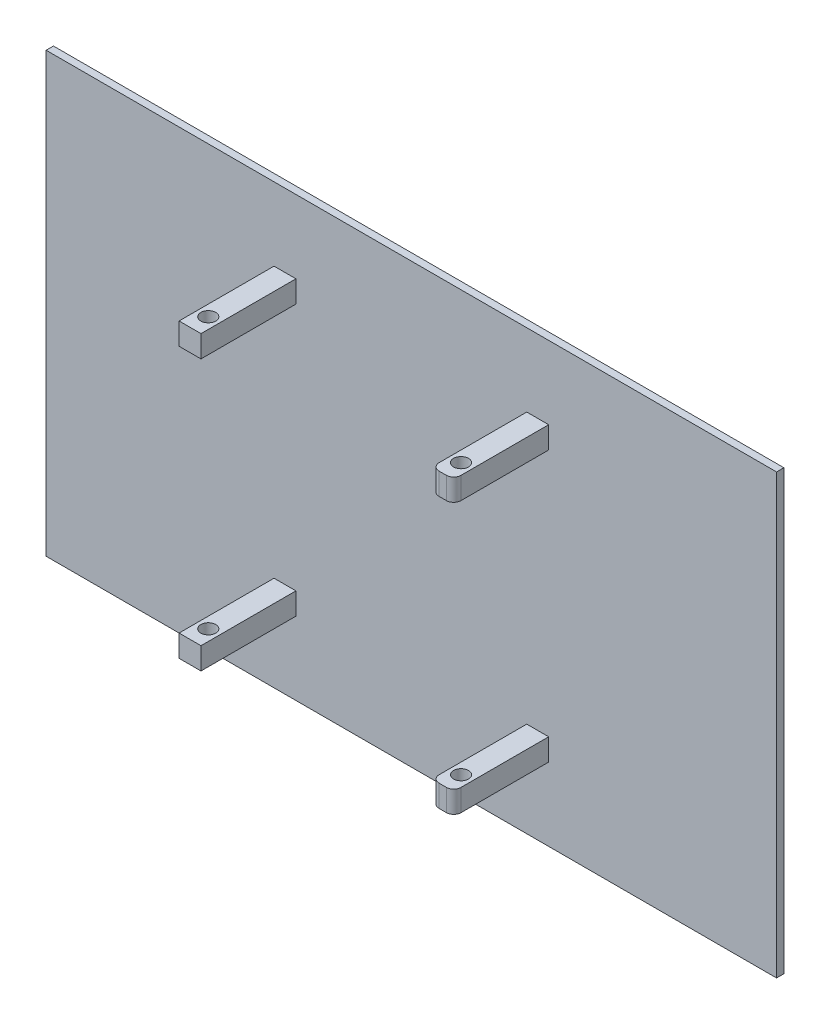
ISO-10303-21;
HEADER;
FILE_DESCRIPTION(('STEP AP214'),'2;1');
FILE_NAME('part.step','',(''),(''),'','','');
FILE_SCHEMA(('AUTOMOTIVE_DESIGN { 1 0 10303 214 1 1 1 1 }'));
ENDSEC;
DATA;
#1=APPLICATION_CONTEXT('core data for automotive mechanical design processes');
#2=APPLICATION_PROTOCOL_DEFINITION('international standard','automotive_design',2000,#1);
#3=PRODUCT_CONTEXT('',#1,'mechanical');
#4=PRODUCT('Part','Part','',(#3));
#5=PRODUCT_RELATED_PRODUCT_CATEGORY('part','',(#4));
#6=PRODUCT_DEFINITION_FORMATION('','',#4);
#7=PRODUCT_DEFINITION_CONTEXT('part definition',#1,'design');
#8=PRODUCT_DEFINITION('design','',#6,#7);
#9=PRODUCT_DEFINITION_SHAPE('','',#8);
#10=(LENGTH_UNIT() NAMED_UNIT(*) SI_UNIT(.MILLI.,.METRE.));
#11=(NAMED_UNIT(*) PLANE_ANGLE_UNIT() SI_UNIT($,.RADIAN.));
#12=(NAMED_UNIT(*) SI_UNIT($,.STERADIAN.) SOLID_ANGLE_UNIT());
#13=UNCERTAINTY_MEASURE_WITH_UNIT(LENGTH_MEASURE(1.E-05),#10,'distance_accuracy_value','');
#14=(GEOMETRIC_REPRESENTATION_CONTEXT(3) GLOBAL_UNCERTAINTY_ASSIGNED_CONTEXT((#13)) GLOBAL_UNIT_ASSIGNED_CONTEXT((#10,
#11,#12)) REPRESENTATION_CONTEXT('',''));
#15=CARTESIAN_POINT('',(0.,0.,0.));
#16=DIRECTION('',(0.,0.,1.));
#17=DIRECTION('',(1.,0.,0.));
#18=AXIS2_PLACEMENT_3D('',#15,#16,#17);
#19=CARTESIAN_POINT('',(0.,0.,1.));
#20=DIRECTION('',(0.,0.,-1.));
#21=DIRECTION('',(-1.,0.,0.));
#22=AXIS2_PLACEMENT_3D('',#19,#20,#21);
#23=PLANE('',#22);
#24=DIRECTION('',(0.,-1.,0.));
#25=VECTOR('',#24,1.);
#26=CARTESIAN_POINT('',(15.8,0.,1.));
#27=LINE('',#26,#25);
#28=CARTESIAN_POINT('',(15.8,-17.,0.999999999999999));
#29=VERTEX_POINT('',#28);
#30=CARTESIAN_POINT('',(15.8,-20.,1.));
#31=VERTEX_POINT('',#30);
#32=EDGE_CURVE('E259',#29,#31,#27,.T.);
#33=ORIENTED_EDGE('',*,*,#32,.F.);
#34=DIRECTION('',(-1.,0.,0.));
#35=VECTOR('',#34,1.);
#36=CARTESIAN_POINT('',(0.,-17.,1.));
#37=LINE('',#36,#35);
#38=CARTESIAN_POINT('',(18.8,-17.,1.));
#39=VERTEX_POINT('',#38);
#40=EDGE_CURVE('E250',#39,#29,#37,.T.);
#41=ORIENTED_EDGE('',*,*,#40,.F.);
#42=DIRECTION('',(0.,1.,0.));
#43=VECTOR('',#42,1.);
#44=CARTESIAN_POINT('',(18.8,0.,1.));
#45=LINE('',#44,#43);
#46=CARTESIAN_POINT('',(18.8,-20.,1.));
#47=VERTEX_POINT('',#46);
#48=EDGE_CURVE('E253',#47,#39,#45,.T.);
#49=ORIENTED_EDGE('',*,*,#48,.F.);
#50=DIRECTION('',(1.,0.,0.));
#51=VECTOR('',#50,1.);
#52=CARTESIAN_POINT('',(0.,-20.,1.));
#53=LINE('',#52,#51);
#54=EDGE_CURVE('E256',#31,#47,#53,.T.);
#55=ORIENTED_EDGE('',*,*,#54,.F.);
#56=EDGE_LOOP('',(#33,#41,#49,#55));
#57=FACE_BOUND('',#56,.T.);
#58=DIRECTION('',(0.,1.,0.));
#59=VECTOR('',#58,1.);
#60=CARTESIAN_POINT('',(18.8,0.,1.));
#61=LINE('',#60,#59);
#62=CARTESIAN_POINT('',(18.8,17.,0.999999999999999));
#63=VERTEX_POINT('',#62);
#64=CARTESIAN_POINT('',(18.8,20.,1.));
#65=VERTEX_POINT('',#64);
#66=EDGE_CURVE('E318',#63,#65,#61,.T.);
#67=ORIENTED_EDGE('',*,*,#66,.F.);
#68=DIRECTION('',(1.,0.,0.));
#69=VECTOR('',#68,1.);
#70=CARTESIAN_POINT('',(0.,17.,1.));
#71=LINE('',#70,#69);
#72=CARTESIAN_POINT('',(15.8,17.,1.));
#73=VERTEX_POINT('',#72);
#74=EDGE_CURVE('E309',#73,#63,#71,.T.);
#75=ORIENTED_EDGE('',*,*,#74,.F.);
#76=DIRECTION('',(0.,-1.,0.));
#77=VECTOR('',#76,1.);
#78=CARTESIAN_POINT('',(15.8,0.,1.));
#79=LINE('',#78,#77);
#80=CARTESIAN_POINT('',(15.8,20.,1.));
#81=VERTEX_POINT('',#80);
#82=EDGE_CURVE('E312',#81,#73,#79,.T.);
#83=ORIENTED_EDGE('',*,*,#82,.F.);
#84=DIRECTION('',(-1.,0.,0.));
#85=VECTOR('',#84,1.);
#86=CARTESIAN_POINT('',(0.,20.,1.));
#87=LINE('',#86,#85);
#88=EDGE_CURVE('E315',#65,#81,#87,.T.);
#89=ORIENTED_EDGE('',*,*,#88,.F.);
#90=EDGE_LOOP('',(#67,#75,#83,#89));
#91=FACE_BOUND('',#90,.T.);
#92=DIRECTION('',(0.,1.,0.));
#93=VECTOR('',#92,1.);
#94=CARTESIAN_POINT('',(50.,-30.,1.));
#95=LINE('',#94,#93);
#96=CARTESIAN_POINT('',(50.,-30.,1.));
#97=VERTEX_POINT('',#96);
#98=CARTESIAN_POINT('',(50.,30.,1.));
#99=VERTEX_POINT('',#98);
#100=EDGE_CURVE('E322',#97,#99,#95,.T.);
#101=ORIENTED_EDGE('',*,*,#100,.T.);
#102=DIRECTION('',(-1.,0.,0.));
#103=VECTOR('',#102,1.);
#104=CARTESIAN_POINT('',(-50.,30.,1.));
#105=LINE('',#104,#103);
#106=CARTESIAN_POINT('',(-50.,30.,1.));
#107=VERTEX_POINT('',#106);
#108=EDGE_CURVE('E325',#99,#107,#105,.T.);
#109=ORIENTED_EDGE('',*,*,#108,.T.);
#110=DIRECTION('',(0.,-1.,0.));
#111=VECTOR('',#110,1.);
#112=CARTESIAN_POINT('',(-50.,-30.,1.));
#113=LINE('',#112,#111);
#114=CARTESIAN_POINT('',(-50.,-30.,1.));
#115=VERTEX_POINT('',#114);
#116=EDGE_CURVE('E328',#107,#115,#113,.T.);
#117=ORIENTED_EDGE('',*,*,#116,.T.);
#118=DIRECTION('',(1.,0.,0.));
#119=VECTOR('',#118,1.);
#120=CARTESIAN_POINT('',(-50.,-30.,1.));
#121=LINE('',#120,#119);
#122=EDGE_CURVE('E330',#115,#97,#121,.T.);
#123=ORIENTED_EDGE('',*,*,#122,.T.);
#124=EDGE_LOOP('',(#101,#109,#117,#123));
#125=FACE_BOUND('',#124,.T.);
#126=DIRECTION('',(-1.,0.,0.));
#127=VECTOR('',#126,1.);
#128=CARTESIAN_POINT('',(0.,-17.,1.));
#129=LINE('',#128,#127);
#130=CARTESIAN_POINT('',(-15.8,-17.,0.999999999999999));
#131=VERTEX_POINT('',#130);
#132=CARTESIAN_POINT('',(-18.8,-17.,1.));
#133=VERTEX_POINT('',#132);
#134=EDGE_CURVE('E292',#131,#133,#129,.T.);
#135=ORIENTED_EDGE('',*,*,#134,.F.);
#136=DIRECTION('',(0.,1.,0.));
#137=VECTOR('',#136,1.);
#138=CARTESIAN_POINT('',(-15.8,0.,1.));
#139=LINE('',#138,#137);
#140=CARTESIAN_POINT('',(-15.8,-20.,1.));
#141=VERTEX_POINT('',#140);
#142=EDGE_CURVE('E283',#141,#131,#139,.T.);
#143=ORIENTED_EDGE('',*,*,#142,.F.);
#144=DIRECTION('',(1.,0.,0.));
#145=VECTOR('',#144,1.);
#146=CARTESIAN_POINT('',(0.,-20.,1.));
#147=LINE('',#146,#145);
#148=CARTESIAN_POINT('',(-18.8,-20.,1.));
#149=VERTEX_POINT('',#148);
#150=EDGE_CURVE('E286',#149,#141,#147,.T.);
#151=ORIENTED_EDGE('',*,*,#150,.F.);
#152=DIRECTION('',(0.,-1.,0.));
#153=VECTOR('',#152,1.);
#154=CARTESIAN_POINT('',(-18.8,0.,1.));
#155=LINE('',#154,#153);
#156=EDGE_CURVE('E289',#133,#149,#155,.T.);
#157=ORIENTED_EDGE('',*,*,#156,.F.);
#158=EDGE_LOOP('',(#135,#143,#151,#157));
#159=FACE_BOUND('',#158,.T.);
#160=DIRECTION('',(1.,0.,0.));
#161=VECTOR('',#160,1.);
#162=CARTESIAN_POINT('',(0.,17.,1.));
#163=LINE('',#162,#161);
#164=CARTESIAN_POINT('',(-18.8,17.,0.999999999999999));
#165=VERTEX_POINT('',#164);
#166=CARTESIAN_POINT('',(-15.8,17.,1.));
#167=VERTEX_POINT('',#166);
#168=EDGE_CURVE('E222',#165,#167,#163,.T.);
#169=ORIENTED_EDGE('',*,*,#168,.F.);
#170=DIRECTION('',(0.,-1.,0.));
#171=VECTOR('',#170,1.);
#172=CARTESIAN_POINT('',(-18.8,0.,1.));
#173=LINE('',#172,#171);
#174=CARTESIAN_POINT('',(-18.8,20.,1.));
#175=VERTEX_POINT('',#174);
#176=EDGE_CURVE('E223',#175,#165,#173,.T.);
#177=ORIENTED_EDGE('',*,*,#176,.F.);
#178=DIRECTION('',(-1.,0.,0.));
#179=VECTOR('',#178,1.);
#180=CARTESIAN_POINT('',(0.,20.,1.));
#181=LINE('',#180,#179);
#182=CARTESIAN_POINT('',(-15.8,20.,1.));
#183=VERTEX_POINT('',#182);
#184=EDGE_CURVE('E226',#183,#175,#181,.T.);
#185=ORIENTED_EDGE('',*,*,#184,.F.);
#186=DIRECTION('',(0.,1.,0.));
#187=VECTOR('',#186,1.);
#188=CARTESIAN_POINT('',(-15.8,0.,1.));
#189=LINE('',#188,#187);
#190=EDGE_CURVE('E234',#167,#183,#189,.T.);
#191=ORIENTED_EDGE('',*,*,#190,.F.);
#192=EDGE_LOOP('',(#169,#177,#185,#191));
#193=FACE_BOUND('',#192,.T.);
#194=ADVANCED_FACE('F39',(#57,#91,#125,#159,#193),#23,.F.);
#195=CARTESIAN_POINT('',(50.,-30.,1.));
#196=DIRECTION('',(-1.,0.,0.));
#197=DIRECTION('',(0.,0.,1.));
#198=AXIS2_PLACEMENT_3D('',#195,#196,#197);
#199=PLANE('',#198);
#200=DIRECTION('',(0.,1.,0.));
#201=VECTOR('',#200,1.);
#202=CARTESIAN_POINT('',(50.,-30.,0.));
#203=LINE('',#202,#201);
#204=CARTESIAN_POINT('',(50.,-30.,0.));
#205=VERTEX_POINT('',#204);
#206=CARTESIAN_POINT('',(50.,30.,0.));
#207=VERTEX_POINT('',#206);
#208=EDGE_CURVE('E321',#205,#207,#203,.T.);
#209=ORIENTED_EDGE('',*,*,#208,.T.);
#210=DIRECTION('',(0.,0.,-1.));
#211=VECTOR('',#210,1.);
#212=CARTESIAN_POINT('',(50.,30.,1.));
#213=LINE('',#212,#211);
#214=EDGE_CURVE('E348',#99,#207,#213,.T.);
#215=ORIENTED_EDGE('',*,*,#214,.F.);
#216=ORIENTED_EDGE('',*,*,#100,.F.);
#217=DIRECTION('',(0.,0.,-1.));
#218=VECTOR('',#217,1.);
#219=CARTESIAN_POINT('',(50.,-30.,1.));
#220=LINE('',#219,#218);
#221=EDGE_CURVE('E332',#97,#205,#220,.T.);
#222=ORIENTED_EDGE('',*,*,#221,.T.);
#223=EDGE_LOOP('',(#209,#215,#216,#222));
#224=FACE_BOUND('',#223,.T.);
#225=ADVANCED_FACE('F415',(#224),#199,.F.);
#226=CARTESIAN_POINT('',(-50.,30.,1.));
#227=DIRECTION('',(0.,-1.,0.));
#228=DIRECTION('',(0.,0.,-1.));
#229=AXIS2_PLACEMENT_3D('',#226,#227,#228);
#230=PLANE('',#229);
#231=DIRECTION('',(-1.,0.,0.));
#232=VECTOR('',#231,1.);
#233=CARTESIAN_POINT('',(-50.,30.,0.));
#234=LINE('',#233,#232);
#235=CARTESIAN_POINT('',(-50.,30.,0.));
#236=VERTEX_POINT('',#235);
#237=EDGE_CURVE('E335',#207,#236,#234,.T.);
#238=ORIENTED_EDGE('',*,*,#237,.T.);
#239=DIRECTION('',(0.,0.,-1.));
#240=VECTOR('',#239,1.);
#241=CARTESIAN_POINT('',(-50.,30.,1.));
#242=LINE('',#241,#240);
#243=EDGE_CURVE('E345',#107,#236,#242,.T.);
#244=ORIENTED_EDGE('',*,*,#243,.F.);
#245=ORIENTED_EDGE('',*,*,#108,.F.);
#246=ORIENTED_EDGE('',*,*,#214,.T.);
#247=EDGE_LOOP('',(#238,#244,#245,#246));
#248=FACE_BOUND('',#247,.T.);
#249=ADVANCED_FACE('F423',(#248),#230,.F.);
#250=CARTESIAN_POINT('',(-50.,-30.,1.));
#251=DIRECTION('',(1.,0.,0.));
#252=DIRECTION('',(0.,0.,-1.));
#253=AXIS2_PLACEMENT_3D('',#250,#251,#252);
#254=PLANE('',#253);
#255=DIRECTION('',(0.,-1.,0.));
#256=VECTOR('',#255,1.);
#257=CARTESIAN_POINT('',(-50.,-30.,0.));
#258=LINE('',#257,#256);
#259=CARTESIAN_POINT('',(-50.,-30.,0.));
#260=VERTEX_POINT('',#259);
#261=EDGE_CURVE('E337',#236,#260,#258,.T.);
#262=ORIENTED_EDGE('',*,*,#261,.T.);
#263=DIRECTION('',(0.,0.,-1.));
#264=VECTOR('',#263,1.);
#265=CARTESIAN_POINT('',(-50.,-30.,1.));
#266=LINE('',#265,#264);
#267=EDGE_CURVE('E342',#115,#260,#266,.T.);
#268=ORIENTED_EDGE('',*,*,#267,.F.);
#269=ORIENTED_EDGE('',*,*,#116,.F.);
#270=ORIENTED_EDGE('',*,*,#243,.T.);
#271=EDGE_LOOP('',(#262,#268,#269,#270));
#272=FACE_BOUND('',#271,.T.);
#273=ADVANCED_FACE('F438',(#272),#254,.F.);
#274=CARTESIAN_POINT('',(-50.,-30.,1.));
#275=DIRECTION('',(0.,1.,0.));
#276=DIRECTION('',(0.,0.,1.));
#277=AXIS2_PLACEMENT_3D('',#274,#275,#276);
#278=PLANE('',#277);
#279=DIRECTION('',(1.,0.,0.));
#280=VECTOR('',#279,1.);
#281=CARTESIAN_POINT('',(-50.,-30.,0.));
#282=LINE('',#281,#280);
#283=EDGE_CURVE('E326',#260,#205,#282,.T.);
#284=ORIENTED_EDGE('',*,*,#283,.T.);
#285=ORIENTED_EDGE('',*,*,#221,.F.);
#286=ORIENTED_EDGE('',*,*,#122,.F.);
#287=ORIENTED_EDGE('',*,*,#267,.T.);
#288=EDGE_LOOP('',(#284,#285,#286,#287));
#289=FACE_BOUND('',#288,.T.);
#290=ADVANCED_FACE('F434',(#289),#278,.F.);
#291=CARTESIAN_POINT('',(0.,0.,0.));
#292=DIRECTION('',(0.,0.,-1.));
#293=DIRECTION('',(-1.,0.,0.));
#294=AXIS2_PLACEMENT_3D('',#291,#292,#293);
#295=PLANE('',#294);
#296=ORIENTED_EDGE('',*,*,#208,.F.);
#297=ORIENTED_EDGE('',*,*,#283,.F.);
#298=ORIENTED_EDGE('',*,*,#261,.F.);
#299=ORIENTED_EDGE('',*,*,#237,.F.);
#300=EDGE_LOOP('',(#296,#297,#298,#299));
#301=FACE_BOUND('',#300,.T.);
#302=ADVANCED_FACE('F432',(#301),#295,.T.);
#303=CARTESIAN_POINT('',(18.8,17.,14.));
#304=DIRECTION('',(-1.,0.,0.));
#305=DIRECTION('',(0.,0.,1.));
#306=AXIS2_PLACEMENT_3D('',#303,#304,#305);
#307=PLANE('',#306);
#308=DIRECTION('',(0.,0.,-1.));
#309=VECTOR('',#308,1.);
#310=CARTESIAN_POINT('',(18.8,20.,14.));
#311=LINE('',#310,#309);
#312=CARTESIAN_POINT('',(18.8,20.,13.));
#313=VERTEX_POINT('',#312);
#314=EDGE_CURVE('E307',#313,#65,#311,.T.);
#315=ORIENTED_EDGE('',*,*,#314,.F.);
#316=DIRECTION('',(0.,1.,0.));
#317=VECTOR('',#316,1.);
#318=CARTESIAN_POINT('',(18.8,17.,13.));
#319=LINE('',#318,#317);
#320=CARTESIAN_POINT('',(18.8,17.,13.));
#321=VERTEX_POINT('',#320);
#322=EDGE_CURVE('E386',#313,#321,#319,.F.);
#323=ORIENTED_EDGE('',*,*,#322,.T.);
#324=DIRECTION('',(0.,0.,-1.));
#325=VECTOR('',#324,1.);
#326=CARTESIAN_POINT('',(18.8,17.,14.));
#327=LINE('',#326,#325);
#328=EDGE_CURVE('E301',#321,#63,#327,.T.);
#329=ORIENTED_EDGE('',*,*,#328,.T.);
#330=ORIENTED_EDGE('',*,*,#66,.T.);
#331=EDGE_LOOP('',(#315,#323,#329,#330));
#332=FACE_BOUND('',#331,.T.);
#333=ADVANCED_FACE('F430',(#332),#307,.F.);
#334=CARTESIAN_POINT('',(15.8,20.,14.));
#335=DIRECTION('',(0.,-1.,0.));
#336=DIRECTION('',(0.,0.,-1.));
#337=AXIS2_PLACEMENT_3D('',#334,#335,#336);
#338=PLANE('',#337);
#339=CARTESIAN_POINT('',(17.3,20.,11.5));
#340=DIRECTION('',(0.,-1.,0.));
#341=DIRECTION('',(0.,0.,-1.));
#342=AXIS2_PLACEMENT_3D('',#339,#340,#341);
#343=CIRCLE('',#342,1.025);
#344=CARTESIAN_POINT('',(17.3,20.,10.475));
#345=VERTEX_POINT('',#344);
#346=EDGE_CURVE('E218',#345,#345,#343,.T.);
#347=ORIENTED_EDGE('',*,*,#346,.T.);
#348=EDGE_LOOP('',(#347));
#349=FACE_BOUND('',#348,.T.);
#350=DIRECTION('',(0.,0.,-1.));
#351=VECTOR('',#350,1.);
#352=CARTESIAN_POINT('',(15.8,20.,14.));
#353=LINE('',#352,#351);
#354=CARTESIAN_POINT('',(15.8,20.,13.));
#355=VERTEX_POINT('',#354);
#356=EDGE_CURVE('E305',#355,#81,#353,.T.);
#357=ORIENTED_EDGE('',*,*,#356,.F.);
#358=CARTESIAN_POINT('',(16.8,20.,13.));
#359=DIRECTION('',(0.,-1.,0.));
#360=DIRECTION('',(0.,0.,-1.));
#361=AXIS2_PLACEMENT_3D('',#358,#359,#360);
#362=CIRCLE('',#361,1.);
#363=CARTESIAN_POINT('',(16.8,20.,14.));
#364=VERTEX_POINT('',#363);
#365=EDGE_CURVE('E384',#355,#364,#362,.F.);
#366=ORIENTED_EDGE('',*,*,#365,.T.);
#367=DIRECTION('',(-1.,0.,0.));
#368=VECTOR('',#367,1.);
#369=CARTESIAN_POINT('',(15.8,20.,14.));
#370=LINE('',#369,#368);
#371=CARTESIAN_POINT('',(17.8,20.,14.));
#372=VERTEX_POINT('',#371);
#373=EDGE_CURVE('E295',#372,#364,#370,.T.);
#374=ORIENTED_EDGE('',*,*,#373,.F.);
#375=CARTESIAN_POINT('',(17.8,20.,13.));
#376=DIRECTION('',(0.,-1.,0.));
#377=DIRECTION('',(0.,0.,-1.));
#378=AXIS2_PLACEMENT_3D('',#375,#376,#377);
#379=CIRCLE('',#378,1.);
#380=EDGE_CURVE('E382',#372,#313,#379,.F.);
#381=ORIENTED_EDGE('',*,*,#380,.T.);
#382=ORIENTED_EDGE('',*,*,#314,.T.);
#383=ORIENTED_EDGE('',*,*,#88,.T.);
#384=EDGE_LOOP('',(#357,#366,#374,#381,#382,#383));
#385=FACE_BOUND('',#384,.T.);
#386=ADVANCED_FACE('F459',(#349,#385),#338,.F.);
#387=CARTESIAN_POINT('',(15.8,17.,14.));
#388=DIRECTION('',(1.,0.,0.));
#389=DIRECTION('',(0.,0.,-1.));
#390=AXIS2_PLACEMENT_3D('',#387,#388,#389);
#391=PLANE('',#390);
#392=DIRECTION('',(0.,0.,-1.));
#393=VECTOR('',#392,1.);
#394=CARTESIAN_POINT('',(15.8,17.,14.));
#395=LINE('',#394,#393);
#396=CARTESIAN_POINT('',(15.8,17.,13.));
#397=VERTEX_POINT('',#396);
#398=EDGE_CURVE('E303',#397,#73,#395,.T.);
#399=ORIENTED_EDGE('',*,*,#398,.F.);
#400=DIRECTION('',(0.,-1.,0.));
#401=VECTOR('',#400,1.);
#402=CARTESIAN_POINT('',(15.8,17.,13.));
#403=LINE('',#402,#401);
#404=EDGE_CURVE('E380',#397,#355,#403,.F.);
#405=ORIENTED_EDGE('',*,*,#404,.T.);
#406=ORIENTED_EDGE('',*,*,#356,.T.);
#407=ORIENTED_EDGE('',*,*,#82,.T.);
#408=EDGE_LOOP('',(#399,#405,#406,#407));
#409=FACE_BOUND('',#408,.T.);
#410=ADVANCED_FACE('F478',(#409),#391,.F.);
#411=CARTESIAN_POINT('',(15.8,17.,14.));
#412=DIRECTION('',(0.,1.,0.));
#413=DIRECTION('',(0.,0.,1.));
#414=AXIS2_PLACEMENT_3D('',#411,#412,#413);
#415=PLANE('',#414);
#416=CARTESIAN_POINT('',(17.3,17.,11.5));
#417=DIRECTION('',(0.,1.,0.));
#418=DIRECTION('',(0.,0.,1.));
#419=AXIS2_PLACEMENT_3D('',#416,#417,#418);
#420=CIRCLE('',#419,1.025);
#421=CARTESIAN_POINT('',(17.3,17.,12.525));
#422=VERTEX_POINT('',#421);
#423=EDGE_CURVE('E563',#422,#422,#420,.T.);
#424=ORIENTED_EDGE('',*,*,#423,.T.);
#425=EDGE_LOOP('',(#424));
#426=FACE_BOUND('',#425,.T.);
#427=DIRECTION('',(1.,0.,0.));
#428=VECTOR('',#427,1.);
#429=CARTESIAN_POINT('',(15.8,17.,14.));
#430=LINE('',#429,#428);
#431=CARTESIAN_POINT('',(16.8,17.,14.));
#432=VERTEX_POINT('',#431);
#433=CARTESIAN_POINT('',(17.8,17.,14.));
#434=VERTEX_POINT('',#433);
#435=EDGE_CURVE('E298',#432,#434,#430,.T.);
#436=ORIENTED_EDGE('',*,*,#435,.F.);
#437=CARTESIAN_POINT('',(16.8,17.,13.));
#438=DIRECTION('',(0.,1.,0.));
#439=DIRECTION('',(0.,0.,1.));
#440=AXIS2_PLACEMENT_3D('',#437,#438,#439);
#441=CIRCLE('',#440,1.);
#442=EDGE_CURVE('E378',#432,#397,#441,.F.);
#443=ORIENTED_EDGE('',*,*,#442,.T.);
#444=ORIENTED_EDGE('',*,*,#398,.T.);
#445=ORIENTED_EDGE('',*,*,#74,.T.);
#446=ORIENTED_EDGE('',*,*,#328,.F.);
#447=CARTESIAN_POINT('',(17.8,17.,13.));
#448=DIRECTION('',(0.,1.,0.));
#449=DIRECTION('',(0.,0.,1.));
#450=AXIS2_PLACEMENT_3D('',#447,#448,#449);
#451=CIRCLE('',#450,1.);
#452=EDGE_CURVE('E376',#321,#434,#451,.F.);
#453=ORIENTED_EDGE('',*,*,#452,.T.);
#454=EDGE_LOOP('',(#436,#443,#444,#445,#446,#453));
#455=FACE_BOUND('',#454,.T.);
#456=ADVANCED_FACE('F475',(#426,#455),#415,.F.);
#457=CARTESIAN_POINT('',(0.,0.,14.));
#458=DIRECTION('',(0.,0.,-1.));
#459=DIRECTION('',(-1.,0.,0.));
#460=AXIS2_PLACEMENT_3D('',#457,#458,#459);
#461=PLANE('',#460);
#462=ORIENTED_EDGE('',*,*,#373,.T.);
#463=DIRECTION('',(0.,-1.,0.));
#464=VECTOR('',#463,1.);
#465=CARTESIAN_POINT('',(16.8,0.,14.));
#466=LINE('',#465,#464);
#467=EDGE_CURVE('E373',#364,#432,#466,.T.);
#468=ORIENTED_EDGE('',*,*,#467,.T.);
#469=ORIENTED_EDGE('',*,*,#435,.T.);
#470=DIRECTION('',(0.,1.,0.));
#471=VECTOR('',#470,1.);
#472=CARTESIAN_POINT('',(17.8,0.,14.));
#473=LINE('',#472,#471);
#474=EDGE_CURVE('E370',#434,#372,#473,.T.);
#475=ORIENTED_EDGE('',*,*,#474,.T.);
#476=EDGE_LOOP('',(#462,#468,#469,#475));
#477=FACE_BOUND('',#476,.T.);
#478=ADVANCED_FACE('F461',(#477),#461,.F.);
#479=CARTESIAN_POINT('',(-15.8,-17.,14.));
#480=DIRECTION('',(0.,-1.,0.));
#481=DIRECTION('',(0.,0.,-1.));
#482=AXIS2_PLACEMENT_3D('',#479,#480,#481);
#483=PLANE('',#482);
#484=CARTESIAN_POINT('',(-17.3,-17.,11.5));
#485=DIRECTION('',(0.,-1.,0.));
#486=DIRECTION('',(0.,0.,-1.));
#487=AXIS2_PLACEMENT_3D('',#484,#485,#486);
#488=CIRCLE('',#487,1.025);
#489=CARTESIAN_POINT('',(-17.3,-17.,10.475));
#490=VERTEX_POINT('',#489);
#491=EDGE_CURVE('E360',#490,#490,#488,.F.);
#492=ORIENTED_EDGE('',*,*,#491,.F.);
#493=EDGE_LOOP('',(#492));
#494=FACE_BOUND('',#493,.T.);
#495=DIRECTION('',(0.,0.,-1.));
#496=VECTOR('',#495,1.);
#497=CARTESIAN_POINT('',(-15.8,-17.,14.));
#498=LINE('',#497,#496);
#499=CARTESIAN_POINT('',(-15.8,-17.,14.));
#500=VERTEX_POINT('',#499);
#501=EDGE_CURVE('E271',#500,#131,#498,.T.);
#502=ORIENTED_EDGE('',*,*,#501,.T.);
#503=ORIENTED_EDGE('',*,*,#134,.T.);
#504=DIRECTION('',(0.,0.,-1.));
#505=VECTOR('',#504,1.);
#506=CARTESIAN_POINT('',(-18.8,-17.,14.));
#507=LINE('',#506,#505);
#508=CARTESIAN_POINT('',(-18.8,-17.,14.));
#509=VERTEX_POINT('',#508);
#510=EDGE_CURVE('E280',#509,#133,#507,.T.);
#511=ORIENTED_EDGE('',*,*,#510,.F.);
#512=DIRECTION('',(-1.,0.,0.));
#513=VECTOR('',#512,1.);
#514=CARTESIAN_POINT('',(-15.8,-17.,14.));
#515=LINE('',#514,#513);
#516=EDGE_CURVE('E262',#500,#509,#515,.T.);
#517=ORIENTED_EDGE('',*,*,#516,.F.);
#518=EDGE_LOOP('',(#502,#503,#511,#517));
#519=FACE_BOUND('',#518,.T.);
#520=ADVANCED_FACE('F491',(#494,#519),#483,.F.);
#521=CARTESIAN_POINT('',(-18.8,-17.,14.));
#522=DIRECTION('',(1.,0.,0.));
#523=DIRECTION('',(0.,0.,-1.));
#524=AXIS2_PLACEMENT_3D('',#521,#522,#523);
#525=PLANE('',#524);
#526=ORIENTED_EDGE('',*,*,#510,.T.);
#527=ORIENTED_EDGE('',*,*,#156,.T.);
#528=DIRECTION('',(0.,0.,-1.));
#529=VECTOR('',#528,1.);
#530=CARTESIAN_POINT('',(-18.8,-20.,14.));
#531=LINE('',#530,#529);
#532=CARTESIAN_POINT('',(-18.8,-20.,14.));
#533=VERTEX_POINT('',#532);
#534=EDGE_CURVE('E277',#533,#149,#531,.T.);
#535=ORIENTED_EDGE('',*,*,#534,.F.);
#536=DIRECTION('',(0.,-1.,0.));
#537=VECTOR('',#536,1.);
#538=CARTESIAN_POINT('',(-18.8,-17.,14.));
#539=LINE('',#538,#537);
#540=EDGE_CURVE('E265',#509,#533,#539,.T.);
#541=ORIENTED_EDGE('',*,*,#540,.F.);
#542=EDGE_LOOP('',(#526,#527,#535,#541));
#543=FACE_BOUND('',#542,.T.);
#544=ADVANCED_FACE('F494',(#543),#525,.F.);
#545=CARTESIAN_POINT('',(-15.8,-20.,14.));
#546=DIRECTION('',(0.,1.,0.));
#547=DIRECTION('',(0.,0.,1.));
#548=AXIS2_PLACEMENT_3D('',#545,#546,#547);
#549=PLANE('',#548);
#550=CARTESIAN_POINT('',(-17.3,-20.,11.5));
#551=DIRECTION('',(0.,1.,0.));
#552=DIRECTION('',(0.,0.,1.));
#553=AXIS2_PLACEMENT_3D('',#550,#551,#552);
#554=CIRCLE('',#553,1.025);
#555=CARTESIAN_POINT('',(-17.3,-20.,12.525));
#556=VERTEX_POINT('',#555);
#557=EDGE_CURVE('E581',#556,#556,#554,.F.);
#558=ORIENTED_EDGE('',*,*,#557,.F.);
#559=EDGE_LOOP('',(#558));
#560=FACE_BOUND('',#559,.T.);
#561=ORIENTED_EDGE('',*,*,#534,.T.);
#562=ORIENTED_EDGE('',*,*,#150,.T.);
#563=DIRECTION('',(0.,0.,-1.));
#564=VECTOR('',#563,1.);
#565=CARTESIAN_POINT('',(-15.8,-20.,14.));
#566=LINE('',#565,#564);
#567=CARTESIAN_POINT('',(-15.8,-20.,14.));
#568=VERTEX_POINT('',#567);
#569=EDGE_CURVE('E274',#568,#141,#566,.T.);
#570=ORIENTED_EDGE('',*,*,#569,.F.);
#571=DIRECTION('',(1.,0.,0.));
#572=VECTOR('',#571,1.);
#573=CARTESIAN_POINT('',(-15.8,-20.,14.));
#574=LINE('',#573,#572);
#575=EDGE_CURVE('E267',#533,#568,#574,.T.);
#576=ORIENTED_EDGE('',*,*,#575,.F.);
#577=EDGE_LOOP('',(#561,#562,#570,#576));
#578=FACE_BOUND('',#577,.T.);
#579=ADVANCED_FACE('F498',(#560,#578),#549,.F.);
#580=CARTESIAN_POINT('',(-15.8,-17.,14.));
#581=DIRECTION('',(-1.,0.,0.));
#582=DIRECTION('',(0.,0.,1.));
#583=AXIS2_PLACEMENT_3D('',#580,#581,#582);
#584=PLANE('',#583);
#585=ORIENTED_EDGE('',*,*,#569,.T.);
#586=ORIENTED_EDGE('',*,*,#142,.T.);
#587=ORIENTED_EDGE('',*,*,#501,.F.);
#588=DIRECTION('',(0.,1.,0.));
#589=VECTOR('',#588,1.);
#590=CARTESIAN_POINT('',(-15.8,-17.,14.));
#591=LINE('',#590,#589);
#592=EDGE_CURVE('E269',#568,#500,#591,.T.);
#593=ORIENTED_EDGE('',*,*,#592,.F.);
#594=EDGE_LOOP('',(#585,#586,#587,#593));
#595=FACE_BOUND('',#594,.T.);
#596=ADVANCED_FACE('F502',(#595),#584,.F.);
#597=CARTESIAN_POINT('',(0.,0.,14.));
#598=DIRECTION('',(0.,0.,1.));
#599=DIRECTION('',(1.,0.,0.));
#600=AXIS2_PLACEMENT_3D('',#597,#598,#599);
#601=PLANE('',#600);
#602=ORIENTED_EDGE('',*,*,#516,.T.);
#603=ORIENTED_EDGE('',*,*,#540,.T.);
#604=ORIENTED_EDGE('',*,*,#575,.T.);
#605=ORIENTED_EDGE('',*,*,#592,.T.);
#606=EDGE_LOOP('',(#602,#603,#604,#605));
#607=FACE_BOUND('',#606,.T.);
#608=ADVANCED_FACE('F506',(#607),#601,.T.);
#609=CARTESIAN_POINT('',(15.8,-17.,14.));
#610=DIRECTION('',(1.,0.,0.));
#611=DIRECTION('',(0.,0.,-1.));
#612=AXIS2_PLACEMENT_3D('',#609,#610,#611);
#613=PLANE('',#612);
#614=DIRECTION('',(0.,0.,-1.));
#615=VECTOR('',#614,1.);
#616=CARTESIAN_POINT('',(15.8,-20.,14.));
#617=LINE('',#616,#615);
#618=CARTESIAN_POINT('',(15.8,-20.,13.));
#619=VERTEX_POINT('',#618);
#620=EDGE_CURVE('E248',#619,#31,#617,.T.);
#621=ORIENTED_EDGE('',*,*,#620,.F.);
#622=DIRECTION('',(0.,-1.,0.));
#623=VECTOR('',#622,1.);
#624=CARTESIAN_POINT('',(15.8,-17.,13.));
#625=LINE('',#624,#623);
#626=CARTESIAN_POINT('',(15.8,-17.,13.));
#627=VERTEX_POINT('',#626);
#628=EDGE_CURVE('E365',#619,#627,#625,.F.);
#629=ORIENTED_EDGE('',*,*,#628,.T.);
#630=DIRECTION('',(0.,0.,-1.));
#631=VECTOR('',#630,1.);
#632=CARTESIAN_POINT('',(15.8,-17.,14.));
#633=LINE('',#632,#631);
#634=EDGE_CURVE('E242',#627,#29,#633,.T.);
#635=ORIENTED_EDGE('',*,*,#634,.T.);
#636=ORIENTED_EDGE('',*,*,#32,.T.);
#637=EDGE_LOOP('',(#621,#629,#635,#636));
#638=FACE_BOUND('',#637,.T.);
#639=ADVANCED_FACE('F510',(#638),#613,.F.);
#640=CARTESIAN_POINT('',(15.8,-20.,14.));
#641=DIRECTION('',(0.,1.,0.));
#642=DIRECTION('',(0.,0.,1.));
#643=AXIS2_PLACEMENT_3D('',#640,#641,#642);
#644=PLANE('',#643);
#645=CARTESIAN_POINT('',(17.3,-20.,11.5));
#646=DIRECTION('',(0.,1.,0.));
#647=DIRECTION('',(0.,0.,1.));
#648=AXIS2_PLACEMENT_3D('',#645,#646,#647);
#649=CIRCLE('',#648,1.025);
#650=CARTESIAN_POINT('',(17.3,-20.,12.525));
#651=VERTEX_POINT('',#650);
#652=EDGE_CURVE('E359',#651,#651,#649,.T.);
#653=ORIENTED_EDGE('',*,*,#652,.T.);
#654=EDGE_LOOP('',(#653));
#655=FACE_BOUND('',#654,.T.);
#656=DIRECTION('',(0.,0.,-1.));
#657=VECTOR('',#656,1.);
#658=CARTESIAN_POINT('',(18.8,-20.,14.));
#659=LINE('',#658,#657);
#660=CARTESIAN_POINT('',(18.8,-20.,13.));
#661=VERTEX_POINT('',#660);
#662=EDGE_CURVE('E246',#661,#47,#659,.T.);
#663=ORIENTED_EDGE('',*,*,#662,.F.);
#664=CARTESIAN_POINT('',(17.8,-20.,13.));
#665=DIRECTION('',(0.,1.,0.));
#666=DIRECTION('',(0.,0.,1.));
#667=AXIS2_PLACEMENT_3D('',#664,#665,#666);
#668=CIRCLE('',#667,1.);
#669=CARTESIAN_POINT('',(17.8,-20.,14.));
#670=VERTEX_POINT('',#669);
#671=EDGE_CURVE('E11',#661,#670,#668,.F.);
#672=ORIENTED_EDGE('',*,*,#671,.T.);
#673=DIRECTION('',(1.,0.,0.));
#674=VECTOR('',#673,1.);
#675=CARTESIAN_POINT('',(15.8,-20.,14.));
#676=LINE('',#675,#674);
#677=CARTESIAN_POINT('',(16.8,-20.,14.));
#678=VERTEX_POINT('',#677);
#679=EDGE_CURVE('E237',#678,#670,#676,.T.);
#680=ORIENTED_EDGE('',*,*,#679,.F.);
#681=CARTESIAN_POINT('',(16.8,-20.,13.));
#682=DIRECTION('',(0.,1.,0.));
#683=DIRECTION('',(0.,0.,1.));
#684=AXIS2_PLACEMENT_3D('',#681,#682,#683);
#685=CIRCLE('',#684,1.);
#686=EDGE_CURVE('E363',#678,#619,#685,.F.);
#687=ORIENTED_EDGE('',*,*,#686,.T.);
#688=ORIENTED_EDGE('',*,*,#620,.T.);
#689=ORIENTED_EDGE('',*,*,#54,.T.);
#690=EDGE_LOOP('',(#663,#672,#680,#687,#688,#689));
#691=FACE_BOUND('',#690,.T.);
#692=ADVANCED_FACE('F405',(#655,#691),#644,.F.);
#693=CARTESIAN_POINT('',(18.8,-17.,14.));
#694=DIRECTION('',(-1.,0.,0.));
#695=DIRECTION('',(0.,0.,1.));
#696=AXIS2_PLACEMENT_3D('',#693,#694,#695);
#697=PLANE('',#696);
#698=DIRECTION('',(0.,0.,-1.));
#699=VECTOR('',#698,1.);
#700=CARTESIAN_POINT('',(18.8,-17.,14.));
#701=LINE('',#700,#699);
#702=CARTESIAN_POINT('',(18.8,-17.,13.));
#703=VERTEX_POINT('',#702);
#704=EDGE_CURVE('E244',#703,#39,#701,.T.);
#705=ORIENTED_EDGE('',*,*,#704,.F.);
#706=DIRECTION('',(0.,1.,0.));
#707=VECTOR('',#706,1.);
#708=CARTESIAN_POINT('',(18.8,-20.,13.));
#709=LINE('',#708,#707);
#710=EDGE_CURVE('E47',#703,#661,#709,.F.);
#711=ORIENTED_EDGE('',*,*,#710,.T.);
#712=ORIENTED_EDGE('',*,*,#662,.T.);
#713=ORIENTED_EDGE('',*,*,#48,.T.);
#714=EDGE_LOOP('',(#705,#711,#712,#713));
#715=FACE_BOUND('',#714,.T.);
#716=ADVANCED_FACE('F517',(#715),#697,.F.);
#717=CARTESIAN_POINT('',(15.8,-17.,14.));
#718=DIRECTION('',(0.,-1.,0.));
#719=DIRECTION('',(0.,0.,-1.));
#720=AXIS2_PLACEMENT_3D('',#717,#718,#719);
#721=PLANE('',#720);
#722=CARTESIAN_POINT('',(17.3,-17.,11.5));
#723=DIRECTION('',(0.,-1.,0.));
#724=DIRECTION('',(0.,0.,-1.));
#725=AXIS2_PLACEMENT_3D('',#722,#723,#724);
#726=CIRCLE('',#725,1.025);
#727=CARTESIAN_POINT('',(17.3,-17.,10.475));
#728=VERTEX_POINT('',#727);
#729=EDGE_CURVE('E356',#728,#728,#726,.T.);
#730=ORIENTED_EDGE('',*,*,#729,.T.);
#731=EDGE_LOOP('',(#730));
#732=FACE_BOUND('',#731,.T.);
#733=DIRECTION('',(-1.,0.,0.));
#734=VECTOR('',#733,1.);
#735=CARTESIAN_POINT('',(15.8,-17.,14.));
#736=LINE('',#735,#734);
#737=CARTESIAN_POINT('',(17.8,-17.,14.));
#738=VERTEX_POINT('',#737);
#739=CARTESIAN_POINT('',(16.8,-17.,14.));
#740=VERTEX_POINT('',#739);
#741=EDGE_CURVE('E240',#738,#740,#736,.T.);
#742=ORIENTED_EDGE('',*,*,#741,.F.);
#743=CARTESIAN_POINT('',(17.8,-17.,13.));
#744=DIRECTION('',(0.,-1.,0.));
#745=DIRECTION('',(0.,0.,-1.));
#746=AXIS2_PLACEMENT_3D('',#743,#744,#745);
#747=CIRCLE('',#746,1.);
#748=EDGE_CURVE('E61',#738,#703,#747,.F.);
#749=ORIENTED_EDGE('',*,*,#748,.T.);
#750=ORIENTED_EDGE('',*,*,#704,.T.);
#751=ORIENTED_EDGE('',*,*,#40,.T.);
#752=ORIENTED_EDGE('',*,*,#634,.F.);
#753=CARTESIAN_POINT('',(16.8,-17.,13.));
#754=DIRECTION('',(0.,-1.,0.));
#755=DIRECTION('',(0.,0.,-1.));
#756=AXIS2_PLACEMENT_3D('',#753,#754,#755);
#757=CIRCLE('',#756,1.);
#758=EDGE_CURVE('E367',#627,#740,#757,.F.);
#759=ORIENTED_EDGE('',*,*,#758,.T.);
#760=EDGE_LOOP('',(#742,#749,#750,#751,#752,#759));
#761=FACE_BOUND('',#760,.T.);
#762=ADVANCED_FACE('F397',(#732,#761),#721,.F.);
#763=CARTESIAN_POINT('',(0.,0.,14.));
#764=DIRECTION('',(0.,0.,1.));
#765=DIRECTION('',(1.,0.,0.));
#766=AXIS2_PLACEMENT_3D('',#763,#764,#765);
#767=PLANE('',#766);
#768=ORIENTED_EDGE('',*,*,#679,.T.);
#769=DIRECTION('',(0.,1.,0.));
#770=VECTOR('',#769,1.);
#771=CARTESIAN_POINT('',(17.8,-17.,14.));
#772=LINE('',#771,#770);
#773=EDGE_CURVE('E388',#670,#738,#772,.T.);
#774=ORIENTED_EDGE('',*,*,#773,.T.);
#775=ORIENTED_EDGE('',*,*,#741,.T.);
#776=DIRECTION('',(0.,-1.,0.));
#777=VECTOR('',#776,1.);
#778=CARTESIAN_POINT('',(16.8,-20.,14.));
#779=LINE('',#778,#777);
#780=EDGE_CURVE('E351',#740,#678,#779,.T.);
#781=ORIENTED_EDGE('',*,*,#780,.T.);
#782=EDGE_LOOP('',(#768,#774,#775,#781));
#783=FACE_BOUND('',#782,.T.);
#784=ADVANCED_FACE('F393',(#783),#767,.T.);
#785=CARTESIAN_POINT('',(-15.8,17.,14.));
#786=DIRECTION('',(0.,1.,0.));
#787=DIRECTION('',(0.,0.,1.));
#788=AXIS2_PLACEMENT_3D('',#785,#786,#787);
#789=PLANE('',#788);
#790=CARTESIAN_POINT('',(-17.3,17.,11.5));
#791=DIRECTION('',(0.,1.,0.));
#792=DIRECTION('',(0.,0.,1.));
#793=AXIS2_PLACEMENT_3D('',#790,#791,#792);
#794=CIRCLE('',#793,1.025);
#795=CARTESIAN_POINT('',(-17.3,17.,12.525));
#796=VERTEX_POINT('',#795);
#797=EDGE_CURVE('E355',#796,#796,#794,.F.);
#798=ORIENTED_EDGE('',*,*,#797,.F.);
#799=EDGE_LOOP('',(#798));
#800=FACE_BOUND('',#799,.T.);
#801=DIRECTION('',(0.,0.,-1.));
#802=VECTOR('',#801,1.);
#803=CARTESIAN_POINT('',(-18.8,17.,14.));
#804=LINE('',#803,#802);
#805=CARTESIAN_POINT('',(-18.8,17.,14.));
#806=VERTEX_POINT('',#805);
#807=EDGE_CURVE('E574',#806,#165,#804,.T.);
#808=ORIENTED_EDGE('',*,*,#807,.T.);
#809=ORIENTED_EDGE('',*,*,#168,.T.);
#810=DIRECTION('',(0.,0.,-1.));
#811=VECTOR('',#810,1.);
#812=CARTESIAN_POINT('',(-15.8,17.,14.));
#813=LINE('',#812,#811);
#814=CARTESIAN_POINT('',(-15.8,17.,14.));
#815=VERTEX_POINT('',#814);
#816=EDGE_CURVE('E203',#815,#167,#813,.T.);
#817=ORIENTED_EDGE('',*,*,#816,.F.);
#818=DIRECTION('',(1.,0.,0.));
#819=VECTOR('',#818,1.);
#820=CARTESIAN_POINT('',(-15.8,17.,14.));
#821=LINE('',#820,#819);
#822=EDGE_CURVE('E209',#806,#815,#821,.T.);
#823=ORIENTED_EDGE('',*,*,#822,.F.);
#824=EDGE_LOOP('',(#808,#809,#817,#823));
#825=FACE_BOUND('',#824,.T.);
#826=ADVANCED_FACE('F221',(#800,#825),#789,.F.);
#827=CARTESIAN_POINT('',(-15.8,17.,14.));
#828=DIRECTION('',(-1.,0.,0.));
#829=DIRECTION('',(0.,0.,1.));
#830=AXIS2_PLACEMENT_3D('',#827,#828,#829);
#831=PLANE('',#830);
#832=ORIENTED_EDGE('',*,*,#816,.T.);
#833=ORIENTED_EDGE('',*,*,#190,.T.);
#834=DIRECTION('',(0.,0.,-1.));
#835=VECTOR('',#834,1.);
#836=CARTESIAN_POINT('',(-15.8,20.,14.));
#837=LINE('',#836,#835);
#838=CARTESIAN_POINT('',(-15.8,20.,14.));
#839=VERTEX_POINT('',#838);
#840=EDGE_CURVE('E205',#839,#183,#837,.T.);
#841=ORIENTED_EDGE('',*,*,#840,.F.);
#842=DIRECTION('',(0.,1.,0.));
#843=VECTOR('',#842,1.);
#844=CARTESIAN_POINT('',(-15.8,17.,14.));
#845=LINE('',#844,#843);
#846=EDGE_CURVE('E198',#815,#839,#845,.T.);
#847=ORIENTED_EDGE('',*,*,#846,.F.);
#848=EDGE_LOOP('',(#832,#833,#841,#847));
#849=FACE_BOUND('',#848,.T.);
#850=ADVANCED_FACE('F200',(#849),#831,.F.);
#851=CARTESIAN_POINT('',(-15.8,20.,14.));
#852=DIRECTION('',(0.,-1.,0.));
#853=DIRECTION('',(0.,0.,-1.));
#854=AXIS2_PLACEMENT_3D('',#851,#852,#853);
#855=PLANE('',#854);
#856=CARTESIAN_POINT('',(-17.3,20.,11.5));
#857=DIRECTION('',(0.,-1.,0.));
#858=DIRECTION('',(0.,0.,-1.));
#859=AXIS2_PLACEMENT_3D('',#856,#857,#858);
#860=CIRCLE('',#859,1.025);
#861=CARTESIAN_POINT('',(-17.3,20.,10.475));
#862=VERTEX_POINT('',#861);
#863=EDGE_CURVE('E352',#862,#862,#860,.F.);
#864=ORIENTED_EDGE('',*,*,#863,.F.);
#865=EDGE_LOOP('',(#864));
#866=FACE_BOUND('',#865,.T.);
#867=ORIENTED_EDGE('',*,*,#840,.T.);
#868=ORIENTED_EDGE('',*,*,#184,.T.);
#869=DIRECTION('',(0.,0.,-1.));
#870=VECTOR('',#869,1.);
#871=CARTESIAN_POINT('',(-18.8,20.,14.));
#872=LINE('',#871,#870);
#873=CARTESIAN_POINT('',(-18.8,20.,14.));
#874=VERTEX_POINT('',#873);
#875=EDGE_CURVE('E228',#874,#175,#872,.T.);
#876=ORIENTED_EDGE('',*,*,#875,.F.);
#877=DIRECTION('',(-1.,0.,0.));
#878=VECTOR('',#877,1.);
#879=CARTESIAN_POINT('',(-15.8,20.,14.));
#880=LINE('',#879,#878);
#881=EDGE_CURVE('E208',#839,#874,#880,.T.);
#882=ORIENTED_EDGE('',*,*,#881,.F.);
#883=EDGE_LOOP('',(#867,#868,#876,#882));
#884=FACE_BOUND('',#883,.T.);
#885=ADVANCED_FACE('F531',(#866,#884),#855,.F.);
#886=CARTESIAN_POINT('',(-18.8,17.,14.));
#887=DIRECTION('',(1.,0.,0.));
#888=DIRECTION('',(0.,0.,-1.));
#889=AXIS2_PLACEMENT_3D('',#886,#887,#888);
#890=PLANE('',#889);
#891=ORIENTED_EDGE('',*,*,#875,.T.);
#892=ORIENTED_EDGE('',*,*,#176,.T.);
#893=ORIENTED_EDGE('',*,*,#807,.F.);
#894=DIRECTION('',(0.,-1.,0.));
#895=VECTOR('',#894,1.);
#896=CARTESIAN_POINT('',(-18.8,17.,14.));
#897=LINE('',#896,#895);
#898=EDGE_CURVE('E214',#874,#806,#897,.T.);
#899=ORIENTED_EDGE('',*,*,#898,.F.);
#900=EDGE_LOOP('',(#891,#892,#893,#899));
#901=FACE_BOUND('',#900,.T.);
#902=ADVANCED_FACE('F534',(#901),#890,.F.);
#903=CARTESIAN_POINT('',(0.,0.,14.));
#904=DIRECTION('',(0.,0.,-1.));
#905=DIRECTION('',(-1.,0.,0.));
#906=AXIS2_PLACEMENT_3D('',#903,#904,#905);
#907=PLANE('',#906);
#908=ORIENTED_EDGE('',*,*,#822,.T.);
#909=ORIENTED_EDGE('',*,*,#846,.T.);
#910=ORIENTED_EDGE('',*,*,#881,.T.);
#911=ORIENTED_EDGE('',*,*,#898,.T.);
#912=EDGE_LOOP('',(#908,#909,#910,#911));
#913=FACE_BOUND('',#912,.T.);
#914=ADVANCED_FACE('F212',(#913),#907,.F.);
#915=CARTESIAN_POINT('',(-17.3,30.,11.5));
#916=DIRECTION('',(0.,-1.,0.));
#917=DIRECTION('',(0.,0.,-1.));
#918=AXIS2_PLACEMENT_3D('',#915,#916,#917);
#919=CYLINDRICAL_SURFACE('',#918,1.025);
#920=ORIENTED_EDGE('',*,*,#863,.T.);
#921=EDGE_LOOP('',(#920));
#922=FACE_BOUND('',#921,.T.);
#923=ORIENTED_EDGE('',*,*,#797,.T.);
#924=EDGE_LOOP('',(#923));
#925=FACE_BOUND('',#924,.T.);
#926=ADVANCED_FACE('F541',(#922,#925),#919,.F.);
#927=CARTESIAN_POINT('',(17.3,30.,11.5));
#928=DIRECTION('',(0.,-1.,0.));
#929=DIRECTION('',(0.,0.,-1.));
#930=AXIS2_PLACEMENT_3D('',#927,#928,#929);
#931=CYLINDRICAL_SURFACE('',#930,1.025);
#932=ORIENTED_EDGE('',*,*,#729,.F.);
#933=EDGE_LOOP('',(#932));
#934=FACE_BOUND('',#933,.T.);
#935=ORIENTED_EDGE('',*,*,#652,.F.);
#936=EDGE_LOOP('',(#935));
#937=FACE_BOUND('',#936,.T.);
#938=ADVANCED_FACE('F545',(#934,#937),#931,.F.);
#939=ORIENTED_EDGE('',*,*,#557,.T.);
#940=EDGE_LOOP('',(#939));
#941=FACE_BOUND('',#940,.T.);
#942=ORIENTED_EDGE('',*,*,#491,.T.);
#943=EDGE_LOOP('',(#942));
#944=FACE_BOUND('',#943,.T.);
#945=ADVANCED_FACE('F542',(#941,#944),#919,.F.);
#946=ORIENTED_EDGE('',*,*,#423,.F.);
#947=EDGE_LOOP('',(#946));
#948=FACE_BOUND('',#947,.T.);
#949=ORIENTED_EDGE('',*,*,#346,.F.);
#950=EDGE_LOOP('',(#949));
#951=FACE_BOUND('',#950,.T.);
#952=ADVANCED_FACE('F448',(#948,#951),#931,.F.);
#953=CARTESIAN_POINT('',(16.8,0.,13.));
#954=DIRECTION('',(0.,1.,0.));
#955=DIRECTION('',(0.,0.,1.));
#956=AXIS2_PLACEMENT_3D('',#953,#954,#955);
#957=CYLINDRICAL_SURFACE('',#956,1.);
#958=ORIENTED_EDGE('',*,*,#758,.F.);
#959=ORIENTED_EDGE('',*,*,#628,.F.);
#960=ORIENTED_EDGE('',*,*,#686,.F.);
#961=ORIENTED_EDGE('',*,*,#780,.F.);
#962=EDGE_LOOP('',(#958,#959,#960,#961));
#963=FACE_BOUND('',#962,.T.);
#964=ADVANCED_FACE('F403',(#963),#957,.T.);
#965=CARTESIAN_POINT('',(16.8,0.,13.));
#966=DIRECTION('',(0.,-1.,0.));
#967=DIRECTION('',(0.,0.,-1.));
#968=AXIS2_PLACEMENT_3D('',#965,#966,#967);
#969=CYLINDRICAL_SURFACE('',#968,1.);
#970=ORIENTED_EDGE('',*,*,#365,.F.);
#971=ORIENTED_EDGE('',*,*,#404,.F.);
#972=ORIENTED_EDGE('',*,*,#442,.F.);
#973=ORIENTED_EDGE('',*,*,#467,.F.);
#974=EDGE_LOOP('',(#970,#971,#972,#973));
#975=FACE_BOUND('',#974,.T.);
#976=ADVANCED_FACE('F412',(#975),#969,.T.);
#977=CARTESIAN_POINT('',(17.8,0.,13.));
#978=DIRECTION('',(0.,1.,0.));
#979=DIRECTION('',(0.,0.,1.));
#980=AXIS2_PLACEMENT_3D('',#977,#978,#979);
#981=CYLINDRICAL_SURFACE('',#980,1.);
#982=ORIENTED_EDGE('',*,*,#452,.F.);
#983=ORIENTED_EDGE('',*,*,#322,.F.);
#984=ORIENTED_EDGE('',*,*,#380,.F.);
#985=ORIENTED_EDGE('',*,*,#474,.F.);
#986=EDGE_LOOP('',(#982,#983,#984,#985));
#987=FACE_BOUND('',#986,.T.);
#988=ADVANCED_FACE('F408',(#987),#981,.T.);
#989=CARTESIAN_POINT('',(17.8,0.,13.));
#990=DIRECTION('',(0.,-1.,0.));
#991=DIRECTION('',(0.,0.,-1.));
#992=AXIS2_PLACEMENT_3D('',#989,#990,#991);
#993=CYLINDRICAL_SURFACE('',#992,1.);
#994=ORIENTED_EDGE('',*,*,#671,.F.);
#995=ORIENTED_EDGE('',*,*,#710,.F.);
#996=ORIENTED_EDGE('',*,*,#748,.F.);
#997=ORIENTED_EDGE('',*,*,#773,.F.);
#998=EDGE_LOOP('',(#994,#995,#996,#997));
#999=FACE_BOUND('',#998,.T.);
#1000=ADVANCED_FACE('F41',(#999),#993,.T.);
#1001=CLOSED_SHELL('',(#194,#225,#249,#273,#290,#302,#333,#386,#410,#456,#478,#520,#544,#579,
#596,#608,#639,#692,#716,#762,#784,#826,#850,#885,#902,#914,#926,#938,#945,#952,#964,#976,#988,#1000));
#1002=MANIFOLD_SOLID_BREP('B2',#1001);
#1003=ADVANCED_BREP_SHAPE_REPRESENTATION('',(#18,#1002),#14);
#1004=SHAPE_DEFINITION_REPRESENTATION(#9,#1003);
ENDSEC;
END-ISO-10303-21;
